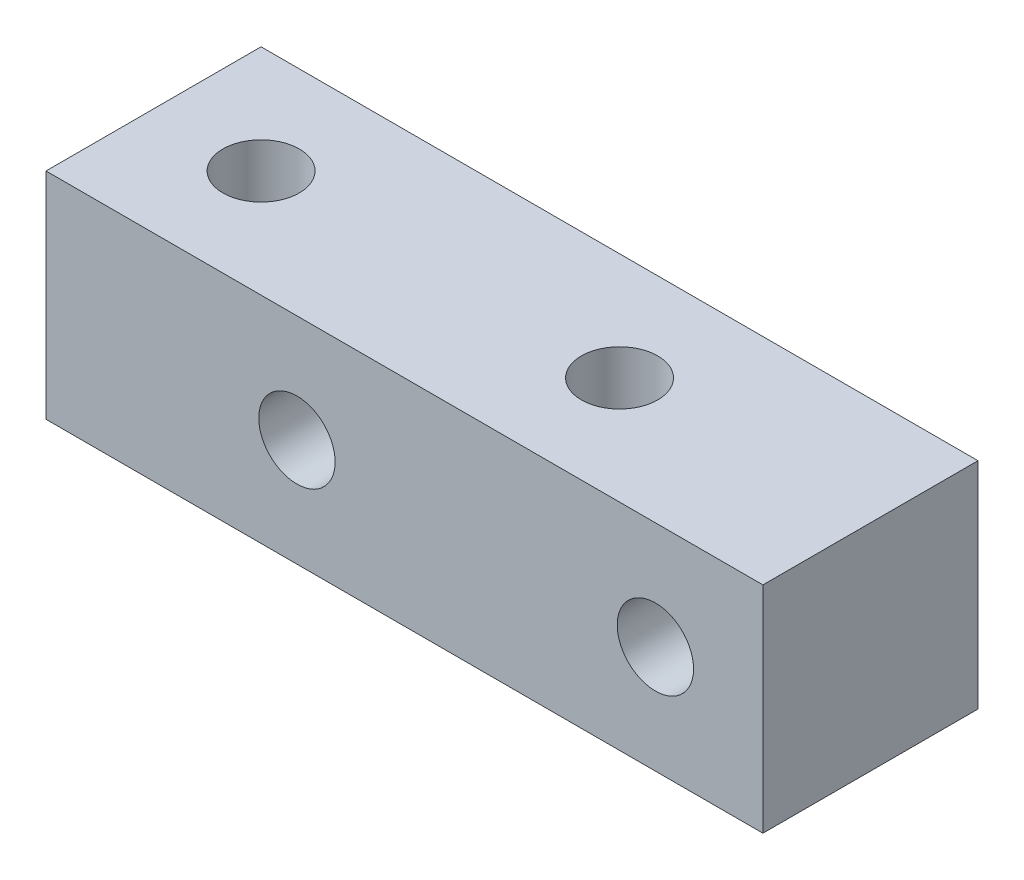
ISO-10303-21;
HEADER;
FILE_DESCRIPTION(('STEP AP214'),'2;1');
FILE_NAME('part.step','',(''),(''),'','','');
FILE_SCHEMA(('AUTOMOTIVE_DESIGN { 1 0 10303 214 1 1 1 1 }'));
ENDSEC;
DATA;
#1=APPLICATION_CONTEXT('core data for automotive mechanical design processes');
#2=APPLICATION_PROTOCOL_DEFINITION('international standard','automotive_design',2000,#1);
#3=PRODUCT_CONTEXT('',#1,'mechanical');
#4=PRODUCT('Part','Part','',(#3));
#5=PRODUCT_RELATED_PRODUCT_CATEGORY('part','',(#4));
#6=PRODUCT_DEFINITION_FORMATION('','',#4);
#7=PRODUCT_DEFINITION_CONTEXT('part definition',#1,'design');
#8=PRODUCT_DEFINITION('design','',#6,#7);
#9=PRODUCT_DEFINITION_SHAPE('','',#8);
#10=(LENGTH_UNIT() NAMED_UNIT(*) SI_UNIT(.MILLI.,.METRE.));
#11=(NAMED_UNIT(*) PLANE_ANGLE_UNIT() SI_UNIT($,.RADIAN.));
#12=(NAMED_UNIT(*) SI_UNIT($,.STERADIAN.) SOLID_ANGLE_UNIT());
#13=UNCERTAINTY_MEASURE_WITH_UNIT(LENGTH_MEASURE(1.E-05),#10,'distance_accuracy_value','');
#14=(GEOMETRIC_REPRESENTATION_CONTEXT(3) GLOBAL_UNCERTAINTY_ASSIGNED_CONTEXT((#13)) GLOBAL_UNIT_ASSIGNED_CONTEXT((#10,
#11,#12)) REPRESENTATION_CONTEXT('',''));
#15=CARTESIAN_POINT('',(0.,0.,0.));
#16=DIRECTION('',(0.,0.,1.));
#17=DIRECTION('',(1.,0.,0.));
#18=AXIS2_PLACEMENT_3D('',#15,#16,#17);
#19=CARTESIAN_POINT('',(-12.7,3.81,3.81));
#20=DIRECTION('',(1.,0.,0.));
#21=DIRECTION('',(0.,0.,-1.));
#22=AXIS2_PLACEMENT_3D('',#19,#20,#21);
#23=PLANE('',#22);
#24=DIRECTION('',(0.,0.,1.));
#25=VECTOR('',#24,1.);
#26=CARTESIAN_POINT('',(-12.7,-3.81,3.81));
#27=LINE('',#26,#25);
#28=CARTESIAN_POINT('',(-12.7,-3.81,-3.81));
#29=VERTEX_POINT('',#28);
#30=CARTESIAN_POINT('',(-12.7,-3.81,3.81));
#31=VERTEX_POINT('',#30);
#32=EDGE_CURVE('E96',#29,#31,#27,.T.);
#33=ORIENTED_EDGE('',*,*,#32,.T.);
#34=DIRECTION('',(0.,-1.,0.));
#35=VECTOR('',#34,1.);
#36=CARTESIAN_POINT('',(-12.7,3.81,3.81));
#37=LINE('',#36,#35);
#38=CARTESIAN_POINT('',(-12.7,3.81,3.81));
#39=VERTEX_POINT('',#38);
#40=EDGE_CURVE('E11',#39,#31,#37,.T.);
#41=ORIENTED_EDGE('',*,*,#40,.F.);
#42=DIRECTION('',(0.,0.,1.));
#43=VECTOR('',#42,1.);
#44=CARTESIAN_POINT('',(-12.7,3.81,3.81));
#45=LINE('',#44,#43);
#46=CARTESIAN_POINT('',(-12.7,3.81,-3.81));
#47=VERTEX_POINT('',#46);
#48=EDGE_CURVE('E84',#47,#39,#45,.T.);
#49=ORIENTED_EDGE('',*,*,#48,.F.);
#50=DIRECTION('',(0.,-1.,0.));
#51=VECTOR('',#50,1.);
#52=CARTESIAN_POINT('',(-12.7,3.81,-3.81));
#53=LINE('',#52,#51);
#54=EDGE_CURVE('E92',#47,#29,#53,.T.);
#55=ORIENTED_EDGE('',*,*,#54,.T.);
#56=EDGE_LOOP('',(#33,#41,#49,#55));
#57=FACE_BOUND('',#56,.T.);
#58=ADVANCED_FACE('F33',(#57),#23,.F.);
#59=CARTESIAN_POINT('',(12.7,3.81,3.81));
#60=DIRECTION('',(0.,0.,-1.));
#61=DIRECTION('',(-1.,0.,0.));
#62=AXIS2_PLACEMENT_3D('',#59,#60,#61);
#63=PLANE('',#62);
#64=CARTESIAN_POINT('',(-3.81000000000001,0.,3.81));
#65=DIRECTION('',(0.,0.,1.));
#66=DIRECTION('',(1.,0.,0.));
#67=AXIS2_PLACEMENT_3D('',#64,#65,#66);
#68=CIRCLE('',#67,1.35254999999999);
#69=CARTESIAN_POINT('',(-2.45745000000002,0.,3.81));
#70=VERTEX_POINT('',#69);
#71=EDGE_CURVE('E130',#70,#70,#68,.T.);
#72=ORIENTED_EDGE('',*,*,#71,.F.);
#73=EDGE_LOOP('',(#72));
#74=FACE_BOUND('',#73,.T.);
#75=CARTESIAN_POINT('',(8.88999999999999,0.,3.81));
#76=DIRECTION('',(0.,0.,1.));
#77=DIRECTION('',(1.,0.,0.));
#78=AXIS2_PLACEMENT_3D('',#75,#76,#77);
#79=CIRCLE('',#78,1.35254999999999);
#80=CARTESIAN_POINT('',(10.24255,0.,3.81));
#81=VERTEX_POINT('',#80);
#82=EDGE_CURVE('E124',#81,#81,#79,.T.);
#83=ORIENTED_EDGE('',*,*,#82,.F.);
#84=EDGE_LOOP('',(#83));
#85=FACE_BOUND('',#84,.T.);
#86=DIRECTION('',(1.,0.,0.));
#87=VECTOR('',#86,1.);
#88=CARTESIAN_POINT('',(12.7,-3.81,3.81));
#89=LINE('',#88,#87);
#90=CARTESIAN_POINT('',(12.7,-3.81,3.81));
#91=VERTEX_POINT('',#90);
#92=EDGE_CURVE('E88',#31,#91,#89,.T.);
#93=ORIENTED_EDGE('',*,*,#92,.T.);
#94=DIRECTION('',(0.,-1.,0.));
#95=VECTOR('',#94,1.);
#96=CARTESIAN_POINT('',(12.7,3.81,3.81));
#97=LINE('',#96,#95);
#98=CARTESIAN_POINT('',(12.7,3.81,3.81));
#99=VERTEX_POINT('',#98);
#100=EDGE_CURVE('E41',#99,#91,#97,.T.);
#101=ORIENTED_EDGE('',*,*,#100,.F.);
#102=DIRECTION('',(1.,0.,0.));
#103=VECTOR('',#102,1.);
#104=CARTESIAN_POINT('',(12.7,3.81,3.81));
#105=LINE('',#104,#103);
#106=EDGE_CURVE('E79',#39,#99,#105,.T.);
#107=ORIENTED_EDGE('',*,*,#106,.F.);
#108=ORIENTED_EDGE('',*,*,#40,.T.);
#109=EDGE_LOOP('',(#93,#101,#107,#108));
#110=FACE_BOUND('',#109,.T.);
#111=ADVANCED_FACE('F87',(#74,#85,#110),#63,.F.);
#112=CARTESIAN_POINT('',(12.7,3.81,3.81));
#113=DIRECTION('',(-1.,0.,0.));
#114=DIRECTION('',(0.,0.,1.));
#115=AXIS2_PLACEMENT_3D('',#112,#113,#114);
#116=PLANE('',#115);
#117=DIRECTION('',(0.,0.,-1.));
#118=VECTOR('',#117,1.);
#119=CARTESIAN_POINT('',(12.7,-3.81,3.81));
#120=LINE('',#119,#118);
#121=CARTESIAN_POINT('',(12.7,-3.81,-3.81));
#122=VERTEX_POINT('',#121);
#123=EDGE_CURVE('E66',#91,#122,#120,.T.);
#124=ORIENTED_EDGE('',*,*,#123,.T.);
#125=DIRECTION('',(0.,-1.,0.));
#126=VECTOR('',#125,1.);
#127=CARTESIAN_POINT('',(12.7,3.81,-3.81));
#128=LINE('',#127,#126);
#129=CARTESIAN_POINT('',(12.7,3.81,-3.81));
#130=VERTEX_POINT('',#129);
#131=EDGE_CURVE('E89',#130,#122,#128,.T.);
#132=ORIENTED_EDGE('',*,*,#131,.F.);
#133=DIRECTION('',(0.,0.,-1.));
#134=VECTOR('',#133,1.);
#135=CARTESIAN_POINT('',(12.7,3.81,3.81));
#136=LINE('',#135,#134);
#137=EDGE_CURVE('E82',#99,#130,#136,.T.);
#138=ORIENTED_EDGE('',*,*,#137,.F.);
#139=ORIENTED_EDGE('',*,*,#100,.T.);
#140=EDGE_LOOP('',(#124,#132,#138,#139));
#141=FACE_BOUND('',#140,.T.);
#142=ADVANCED_FACE('F90',(#141),#116,.F.);
#143=CARTESIAN_POINT('',(12.7,3.81,-3.81));
#144=DIRECTION('',(0.,0.,1.));
#145=DIRECTION('',(1.,0.,0.));
#146=AXIS2_PLACEMENT_3D('',#143,#144,#145);
#147=PLANE('',#146);
#148=CARTESIAN_POINT('',(-3.81000000000001,0.,-3.81));
#149=DIRECTION('',(0.,0.,1.));
#150=DIRECTION('',(1.,0.,0.));
#151=AXIS2_PLACEMENT_3D('',#148,#149,#150);
#152=CIRCLE('',#151,1.35255);
#153=CARTESIAN_POINT('',(-2.45745000000001,0.,-3.81));
#154=VERTEX_POINT('',#153);
#155=EDGE_CURVE('E127',#154,#154,#152,.T.);
#156=ORIENTED_EDGE('',*,*,#155,.T.);
#157=EDGE_LOOP('',(#156));
#158=FACE_BOUND('',#157,.T.);
#159=CARTESIAN_POINT('',(8.88999999999999,0.,-3.81));
#160=DIRECTION('',(0.,0.,1.));
#161=DIRECTION('',(1.,0.,0.));
#162=AXIS2_PLACEMENT_3D('',#159,#160,#161);
#163=CIRCLE('',#162,1.35255);
#164=CARTESIAN_POINT('',(10.24255,0.,-3.81));
#165=VERTEX_POINT('',#164);
#166=EDGE_CURVE('E121',#165,#165,#163,.T.);
#167=ORIENTED_EDGE('',*,*,#166,.T.);
#168=EDGE_LOOP('',(#167));
#169=FACE_BOUND('',#168,.T.);
#170=DIRECTION('',(-1.,0.,0.));
#171=VECTOR('',#170,1.);
#172=CARTESIAN_POINT('',(12.7,-3.81,-3.81));
#173=LINE('',#172,#171);
#174=EDGE_CURVE('E72',#122,#29,#173,.T.);
#175=ORIENTED_EDGE('',*,*,#174,.T.);
#176=ORIENTED_EDGE('',*,*,#54,.F.);
#177=DIRECTION('',(-1.,0.,0.));
#178=VECTOR('',#177,1.);
#179=CARTESIAN_POINT('',(12.7,3.81,-3.81));
#180=LINE('',#179,#178);
#181=EDGE_CURVE('E49',#130,#47,#180,.T.);
#182=ORIENTED_EDGE('',*,*,#181,.F.);
#183=ORIENTED_EDGE('',*,*,#131,.T.);
#184=EDGE_LOOP('',(#175,#176,#182,#183));
#185=FACE_BOUND('',#184,.T.);
#186=ADVANCED_FACE('F104',(#158,#169,#185),#147,.F.);
#187=CARTESIAN_POINT('',(0.,3.81,0.));
#188=DIRECTION('',(0.,1.,0.));
#189=DIRECTION('',(0.,0.,1.));
#190=AXIS2_PLACEMENT_3D('',#187,#188,#189);
#191=PLANE('',#190);
#192=CARTESIAN_POINT('',(-8.89000000000001,3.81,0.));
#193=DIRECTION('',(0.,1.,0.));
#194=DIRECTION('',(0.,0.,1.));
#195=AXIS2_PLACEMENT_3D('',#192,#193,#194);
#196=CIRCLE('',#195,1.35255);
#197=CARTESIAN_POINT('',(-8.89000000000001,3.81,1.35255));
#198=VERTEX_POINT('',#197);
#199=EDGE_CURVE('E118',#198,#198,#196,.T.);
#200=ORIENTED_EDGE('',*,*,#199,.F.);
#201=EDGE_LOOP('',(#200));
#202=FACE_BOUND('',#201,.T.);
#203=CARTESIAN_POINT('',(3.80999999999999,3.81,0.));
#204=DIRECTION('',(0.,1.,0.));
#205=DIRECTION('',(0.,0.,1.));
#206=AXIS2_PLACEMENT_3D('',#203,#204,#205);
#207=CIRCLE('',#206,1.35255);
#208=CARTESIAN_POINT('',(3.80999999999999,3.81,1.35255));
#209=VERTEX_POINT('',#208);
#210=EDGE_CURVE('E112',#209,#209,#207,.T.);
#211=ORIENTED_EDGE('',*,*,#210,.F.);
#212=EDGE_LOOP('',(#211));
#213=FACE_BOUND('',#212,.T.);
#214=ORIENTED_EDGE('',*,*,#48,.T.);
#215=ORIENTED_EDGE('',*,*,#106,.T.);
#216=ORIENTED_EDGE('',*,*,#137,.T.);
#217=ORIENTED_EDGE('',*,*,#181,.T.);
#218=EDGE_LOOP('',(#214,#215,#216,#217));
#219=FACE_BOUND('',#218,.T.);
#220=ADVANCED_FACE('F80',(#202,#213,#219),#191,.T.);
#221=CARTESIAN_POINT('',(0.,-3.81,0.));
#222=DIRECTION('',(0.,1.,0.));
#223=DIRECTION('',(0.,0.,1.));
#224=AXIS2_PLACEMENT_3D('',#221,#222,#223);
#225=PLANE('',#224);
#226=CARTESIAN_POINT('',(-8.89000000000001,-3.81,0.));
#227=DIRECTION('',(0.,1.,0.));
#228=DIRECTION('',(0.,0.,1.));
#229=AXIS2_PLACEMENT_3D('',#226,#227,#228);
#230=CIRCLE('',#229,1.35255);
#231=CARTESIAN_POINT('',(-8.89000000000001,-3.81,1.35255));
#232=VERTEX_POINT('',#231);
#233=EDGE_CURVE('E115',#232,#232,#230,.T.);
#234=ORIENTED_EDGE('',*,*,#233,.T.);
#235=EDGE_LOOP('',(#234));
#236=FACE_BOUND('',#235,.T.);
#237=CARTESIAN_POINT('',(3.80999999999999,-3.81,0.));
#238=DIRECTION('',(0.,1.,0.));
#239=DIRECTION('',(0.,0.,1.));
#240=AXIS2_PLACEMENT_3D('',#237,#238,#239);
#241=CIRCLE('',#240,1.35255);
#242=CARTESIAN_POINT('',(3.80999999999999,-3.81,1.35255));
#243=VERTEX_POINT('',#242);
#244=EDGE_CURVE('E99',#243,#243,#241,.T.);
#245=ORIENTED_EDGE('',*,*,#244,.T.);
#246=EDGE_LOOP('',(#245));
#247=FACE_BOUND('',#246,.T.);
#248=ORIENTED_EDGE('',*,*,#32,.F.);
#249=ORIENTED_EDGE('',*,*,#174,.F.);
#250=ORIENTED_EDGE('',*,*,#123,.F.);
#251=ORIENTED_EDGE('',*,*,#92,.F.);
#252=EDGE_LOOP('',(#248,#249,#250,#251));
#253=FACE_BOUND('',#252,.T.);
#254=ADVANCED_FACE('F107',(#236,#247,#253),#225,.F.);
#255=CARTESIAN_POINT('',(3.80999999999999,3.81,0.));
#256=DIRECTION('',(0.,1.,0.));
#257=DIRECTION('',(0.,0.,1.));
#258=AXIS2_PLACEMENT_3D('',#255,#256,#257);
#259=CYLINDRICAL_SURFACE('',#258,1.35255);
#260=ORIENTED_EDGE('',*,*,#244,.F.);
#261=EDGE_LOOP('',(#260));
#262=FACE_BOUND('',#261,.T.);
#263=ORIENTED_EDGE('',*,*,#210,.T.);
#264=EDGE_LOOP('',(#263));
#265=FACE_BOUND('',#264,.T.);
#266=ADVANCED_FACE('F151',(#262,#265),#259,.F.);
#267=CARTESIAN_POINT('',(-8.89000000000001,3.81,0.));
#268=DIRECTION('',(0.,1.,0.));
#269=DIRECTION('',(0.,0.,1.));
#270=AXIS2_PLACEMENT_3D('',#267,#268,#269);
#271=CYLINDRICAL_SURFACE('',#270,1.35255);
#272=ORIENTED_EDGE('',*,*,#233,.F.);
#273=EDGE_LOOP('',(#272));
#274=FACE_BOUND('',#273,.T.);
#275=ORIENTED_EDGE('',*,*,#199,.T.);
#276=EDGE_LOOP('',(#275));
#277=FACE_BOUND('',#276,.T.);
#278=ADVANCED_FACE('F142',(#274,#277),#271,.F.);
#279=CARTESIAN_POINT('',(8.88999999999999,0.,3.81));
#280=DIRECTION('',(0.,0.,1.));
#281=DIRECTION('',(1.,0.,0.));
#282=AXIS2_PLACEMENT_3D('',#279,#280,#281);
#283=CYLINDRICAL_SURFACE('',#282,1.35254999999999);
#284=ORIENTED_EDGE('',*,*,#166,.F.);
#285=EDGE_LOOP('',(#284));
#286=FACE_BOUND('',#285,.T.);
#287=ORIENTED_EDGE('',*,*,#82,.T.);
#288=EDGE_LOOP('',(#287));
#289=FACE_BOUND('',#288,.T.);
#290=ADVANCED_FACE('F140',(#286,#289),#283,.F.);
#291=CARTESIAN_POINT('',(-3.81000000000001,0.,3.81));
#292=DIRECTION('',(0.,0.,1.));
#293=DIRECTION('',(1.,0.,0.));
#294=AXIS2_PLACEMENT_3D('',#291,#292,#293);
#295=CYLINDRICAL_SURFACE('',#294,1.35254999999999);
#296=ORIENTED_EDGE('',*,*,#155,.F.);
#297=EDGE_LOOP('',(#296));
#298=FACE_BOUND('',#297,.T.);
#299=ORIENTED_EDGE('',*,*,#71,.T.);
#300=EDGE_LOOP('',(#299));
#301=FACE_BOUND('',#300,.T.);
#302=ADVANCED_FACE('F134',(#298,#301),#295,.F.);
#303=CLOSED_SHELL('',(#58,#111,#142,#186,#220,#254,#266,#278,#290,#302));
#304=MANIFOLD_SOLID_BREP('B2',#303);
#305=ADVANCED_BREP_SHAPE_REPRESENTATION('',(#18,#304),#14);
#306=SHAPE_DEFINITION_REPRESENTATION(#9,#305);
ENDSEC;
END-ISO-10303-21;
